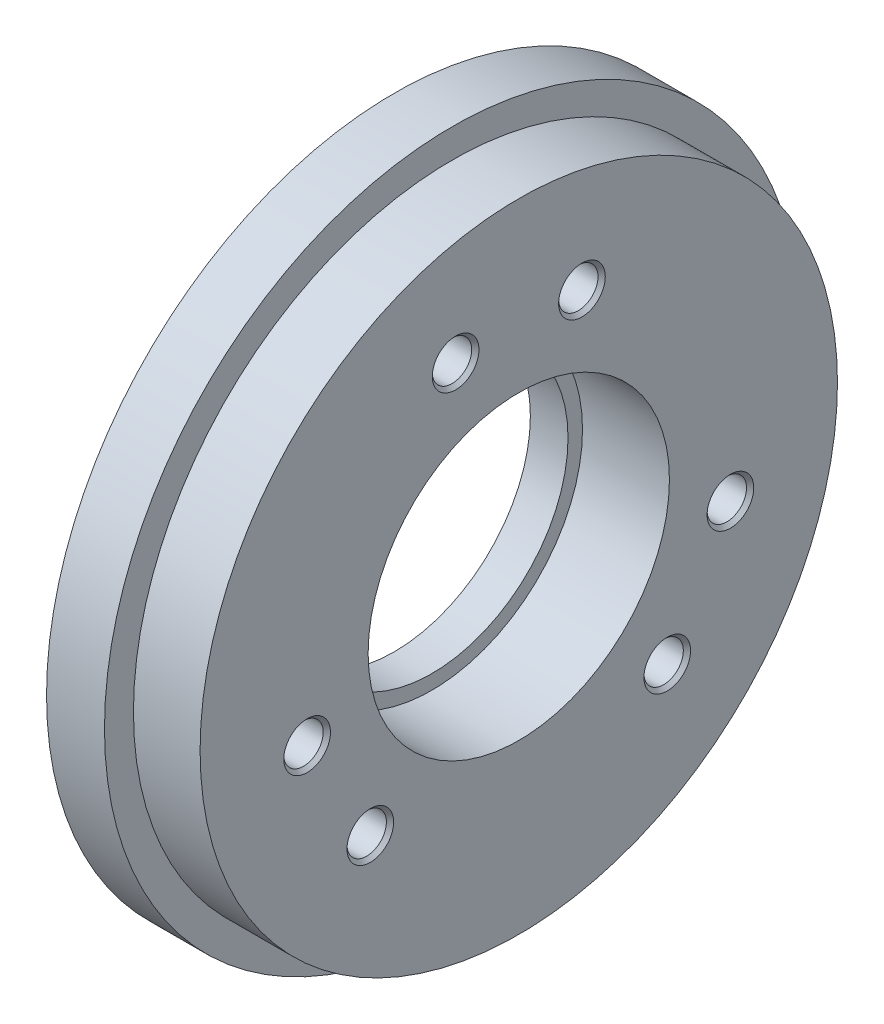
ISO-10303-21;
HEADER;
FILE_DESCRIPTION(('STEP AP214'),'2;1');
FILE_NAME('part.step','',(''),(''),'','','');
FILE_SCHEMA(('AUTOMOTIVE_DESIGN { 1 0 10303 214 1 1 1 1 }'));
ENDSEC;
DATA;
#1=APPLICATION_CONTEXT('core data for automotive mechanical design processes');
#2=APPLICATION_PROTOCOL_DEFINITION('international standard','automotive_design',2000,#1);
#3=PRODUCT_CONTEXT('',#1,'mechanical');
#4=PRODUCT('Part','Part','',(#3));
#5=PRODUCT_RELATED_PRODUCT_CATEGORY('part','',(#4));
#6=PRODUCT_DEFINITION_FORMATION('','',#4);
#7=PRODUCT_DEFINITION_CONTEXT('part definition',#1,'design');
#8=PRODUCT_DEFINITION('design','',#6,#7);
#9=PRODUCT_DEFINITION_SHAPE('','',#8);
#10=(LENGTH_UNIT() NAMED_UNIT(*) SI_UNIT(.MILLI.,.METRE.));
#11=(NAMED_UNIT(*) PLANE_ANGLE_UNIT() SI_UNIT($,.RADIAN.));
#12=(NAMED_UNIT(*) SI_UNIT($,.STERADIAN.) SOLID_ANGLE_UNIT());
#13=UNCERTAINTY_MEASURE_WITH_UNIT(LENGTH_MEASURE(1.E-05),#10,'distance_accuracy_value','');
#14=(GEOMETRIC_REPRESENTATION_CONTEXT(3) GLOBAL_UNCERTAINTY_ASSIGNED_CONTEXT((#13)) GLOBAL_UNIT_ASSIGNED_CONTEXT((#10,
#11,#12)) REPRESENTATION_CONTEXT('',''));
#15=CARTESIAN_POINT('',(0.,0.,0.));
#16=DIRECTION('',(0.,0.,1.));
#17=DIRECTION('',(1.,0.,0.));
#18=AXIS2_PLACEMENT_3D('',#15,#16,#17);
#19=CARTESIAN_POINT('',(-11.5,0.,0.));
#20=DIRECTION('',(1.,0.,0.));
#21=DIRECTION('',(0.,0.,-1.));
#22=AXIS2_PLACEMENT_3D('',#19,#20,#21);
#23=CYLINDRICAL_SURFACE('',#22,55.);
#24=CARTESIAN_POINT('',(-11.5,0.,0.));
#25=DIRECTION('',(-1.,0.,0.));
#26=DIRECTION('',(0.,0.,1.));
#27=AXIS2_PLACEMENT_3D('',#24,#25,#26);
#28=CIRCLE('',#27,55.);
#29=CARTESIAN_POINT('',(-11.5,0.,55.));
#30=VERTEX_POINT('',#29);
#31=EDGE_CURVE('E21',#30,#30,#28,.F.);
#32=ORIENTED_EDGE('',*,*,#31,.T.);
#33=EDGE_LOOP('',(#32));
#34=FACE_BOUND('',#33,.T.);
#35=CARTESIAN_POINT('',(0.,0.,0.));
#36=DIRECTION('',(1.,0.,0.));
#37=DIRECTION('',(0.,0.,-1.));
#38=AXIS2_PLACEMENT_3D('',#35,#36,#37);
#39=CIRCLE('',#38,55.);
#40=CARTESIAN_POINT('',(0.,0.,-55.));
#41=VERTEX_POINT('',#40);
#42=EDGE_CURVE('E10',#41,#41,#39,.T.);
#43=ORIENTED_EDGE('',*,*,#42,.F.);
#44=EDGE_LOOP('',(#43));
#45=FACE_BOUND('',#44,.T.);
#46=ADVANCED_FACE('F15',(#34,#45),#23,.T.);
#47=CARTESIAN_POINT('',(0.,0.,0.));
#48=DIRECTION('',(1.,0.,0.));
#49=DIRECTION('',(0.,0.,-1.));
#50=AXIS2_PLACEMENT_3D('',#47,#48,#49);
#51=PLANE('',#50);
#52=CARTESIAN_POINT('',(0.,-27.3810853732778,-25.6227665130304));
#53=DIRECTION('',(1.,0.,0.));
#54=DIRECTION('',(0.,-0.866025403784443,0.499999999999992));
#55=AXIS2_PLACEMENT_3D('',#52,#53,#54);
#56=CIRCLE('',#55,4.025);
#57=CARTESIAN_POINT('',(0.,-30.8668376235102,-23.6102665130304));
#58=VERTEX_POINT('',#57);
#59=EDGE_CURVE('E97',#58,#58,#56,.T.);
#60=ORIENTED_EDGE('',*,*,#59,.F.);
#61=EDGE_LOOP('',(#60));
#62=FACE_BOUND('',#61,.T.);
#63=CARTESIAN_POINT('',(0.,-8.49942402888248,36.5240987729644));
#64=DIRECTION('',(1.,0.,0.));
#65=DIRECTION('',(0.,0.866025403784437,0.5));
#66=AXIS2_PLACEMENT_3D('',#63,#64,#65);
#67=CIRCLE('',#66,4.025);
#68=CARTESIAN_POINT('',(0.,-5.01367177865012,38.5365987729644));
#69=VERTEX_POINT('',#68);
#70=EDGE_CURVE('E88',#69,#69,#67,.T.);
#71=ORIENTED_EDGE('',*,*,#70,.F.);
#72=EDGE_LOOP('',(#71));
#73=FACE_BOUND('',#72,.T.);
#74=CARTESIAN_POINT('',(0.,-8.49942402888142,-36.5240987729646));
#75=DIRECTION('',(1.,0.,0.));
#76=DIRECTION('',(0.,-0.866025403784443,0.499999999999992));
#77=AXIS2_PLACEMENT_3D('',#74,#75,#76);
#78=CIRCLE('',#77,4.025);
#79=CARTESIAN_POINT('',(0.,-11.9851762791138,-34.5115987729646));
#80=VERTEX_POINT('',#79);
#81=EDGE_CURVE('E79',#80,#80,#78,.T.);
#82=ORIENTED_EDGE('',*,*,#81,.F.);
#83=EDGE_LOOP('',(#82));
#84=FACE_BOUND('',#83,.T.);
#85=CARTESIAN_POINT('',(0.,-27.3810853732785,25.6227665130296));
#86=DIRECTION('',(1.,0.,0.));
#87=DIRECTION('',(0.,0.866025403784437,0.5));
#88=AXIS2_PLACEMENT_3D('',#85,#86,#87);
#89=CIRCLE('',#88,4.025);
#90=CARTESIAN_POINT('',(0.,-23.8953331230462,27.6352665130296));
#91=VERTEX_POINT('',#90);
#92=EDGE_CURVE('E70',#91,#91,#89,.T.);
#93=ORIENTED_EDGE('',*,*,#92,.F.);
#94=EDGE_LOOP('',(#93));
#95=FACE_BOUND('',#94,.T.);
#96=CARTESIAN_POINT('',(0.,35.8805094021602,10.9013322599348));
#97=DIRECTION('',(1.,0.,0.));
#98=DIRECTION('',(0.,0.,-1.));
#99=AXIS2_PLACEMENT_3D('',#96,#97,#98);
#100=CIRCLE('',#99,4.025);
#101=CARTESIAN_POINT('',(0.,35.8805094021602,6.87633225993476));
#102=VERTEX_POINT('',#101);
#103=EDGE_CURVE('E61',#102,#102,#100,.T.);
#104=ORIENTED_EDGE('',*,*,#103,.F.);
#105=EDGE_LOOP('',(#104));
#106=FACE_BOUND('',#105,.T.);
#107=CARTESIAN_POINT('',(0.,35.8805094021603,-10.9013322599342));
#108=DIRECTION('',(1.,0.,0.));
#109=DIRECTION('',(0.,0.,-1.));
#110=AXIS2_PLACEMENT_3D('',#107,#108,#109);
#111=CIRCLE('',#110,4.025);
#112=CARTESIAN_POINT('',(0.,35.8805094021603,-14.9263322599342));
#113=VERTEX_POINT('',#112);
#114=EDGE_CURVE('E52',#113,#113,#111,.T.);
#115=ORIENTED_EDGE('',*,*,#114,.F.);
#116=EDGE_LOOP('',(#115));
#117=FACE_BOUND('',#116,.T.);
#118=CARTESIAN_POINT('',(0.,0.,0.));
#119=DIRECTION('',(1.,0.,0.));
#120=DIRECTION('',(0.,0.,-1.));
#121=AXIS2_PLACEMENT_3D('',#118,#119,#120);
#122=CIRCLE('',#121,26.);
#123=CARTESIAN_POINT('',(0.,0.,-26.));
#124=VERTEX_POINT('',#123);
#125=EDGE_CURVE('E35',#124,#124,#122,.T.);
#126=ORIENTED_EDGE('',*,*,#125,.F.);
#127=EDGE_LOOP('',(#126));
#128=FACE_BOUND('',#127,.T.);
#129=ORIENTED_EDGE('',*,*,#42,.T.);
#130=EDGE_LOOP('',(#129));
#131=FACE_BOUND('',#130,.T.);
#132=ADVANCED_FACE('F103',(#62,#73,#84,#95,#106,#117,#128,#131),#51,.T.);
#133=CARTESIAN_POINT('',(-21.5,0.,0.));
#134=DIRECTION('',(1.,0.,0.));
#135=DIRECTION('',(0.,0.,-1.));
#136=AXIS2_PLACEMENT_3D('',#133,#134,#135);
#137=CYLINDRICAL_SURFACE('',#136,60.);
#138=CARTESIAN_POINT('',(-21.5,0.,0.));
#139=DIRECTION('',(-1.,0.,0.));
#140=DIRECTION('',(0.,0.,1.));
#141=AXIS2_PLACEMENT_3D('',#138,#139,#140);
#142=CIRCLE('',#141,60.);
#143=CARTESIAN_POINT('',(-21.5,0.,60.));
#144=VERTEX_POINT('',#143);
#145=EDGE_CURVE('E25',#144,#144,#142,.T.);
#146=ORIENTED_EDGE('',*,*,#145,.F.);
#147=EDGE_LOOP('',(#146));
#148=FACE_BOUND('',#147,.T.);
#149=CARTESIAN_POINT('',(-11.5,0.,0.));
#150=DIRECTION('',(-1.,0.,0.));
#151=DIRECTION('',(0.,0.,1.));
#152=AXIS2_PLACEMENT_3D('',#149,#150,#151);
#153=CIRCLE('',#152,60.);
#154=CARTESIAN_POINT('',(-11.5,0.,60.));
#155=VERTEX_POINT('',#154);
#156=EDGE_CURVE('E29',#155,#155,#153,.T.);
#157=ORIENTED_EDGE('',*,*,#156,.T.);
#158=EDGE_LOOP('',(#157));
#159=FACE_BOUND('',#158,.T.);
#160=ADVANCED_FACE('F106',(#148,#159),#137,.T.);
#161=CARTESIAN_POINT('',(-21.5,0.,0.));
#162=DIRECTION('',(-1.,0.,0.));
#163=DIRECTION('',(0.,0.,1.));
#164=AXIS2_PLACEMENT_3D('',#161,#162,#163);
#165=PLANE('',#164);
#166=CARTESIAN_POINT('',(-21.5,-27.3810853732778,-25.6227665130304));
#167=DIRECTION('',(1.,0.,0.));
#168=DIRECTION('',(0.,-0.866025403784443,0.499999999999992));
#169=AXIS2_PLACEMENT_3D('',#166,#167,#168);
#170=CIRCLE('',#169,3.4);
#171=CARTESIAN_POINT('',(-21.5,-30.3255717461449,-23.9227665130304));
#172=VERTEX_POINT('',#171);
#173=EDGE_CURVE('E94',#172,#172,#170,.T.);
#174=ORIENTED_EDGE('',*,*,#173,.T.);
#175=EDGE_LOOP('',(#174));
#176=FACE_BOUND('',#175,.T.);
#177=CARTESIAN_POINT('',(-21.5,-8.49942402888248,36.5240987729644));
#178=DIRECTION('',(1.,0.,0.));
#179=DIRECTION('',(0.,0.866025403784437,0.5));
#180=AXIS2_PLACEMENT_3D('',#177,#178,#179);
#181=CIRCLE('',#180,3.4);
#182=CARTESIAN_POINT('',(-21.5,-5.55493765601539,38.2240987729644));
#183=VERTEX_POINT('',#182);
#184=EDGE_CURVE('E85',#183,#183,#181,.T.);
#185=ORIENTED_EDGE('',*,*,#184,.T.);
#186=EDGE_LOOP('',(#185));
#187=FACE_BOUND('',#186,.T.);
#188=CARTESIAN_POINT('',(-21.5,-8.49942402888142,-36.5240987729646));
#189=DIRECTION('',(1.,0.,0.));
#190=DIRECTION('',(0.,-0.866025403784443,0.499999999999992));
#191=AXIS2_PLACEMENT_3D('',#188,#189,#190);
#192=CIRCLE('',#191,3.4);
#193=CARTESIAN_POINT('',(-21.5,-11.4439104017485,-34.8240987729646));
#194=VERTEX_POINT('',#193);
#195=EDGE_CURVE('E76',#194,#194,#192,.T.);
#196=ORIENTED_EDGE('',*,*,#195,.T.);
#197=EDGE_LOOP('',(#196));
#198=FACE_BOUND('',#197,.T.);
#199=CARTESIAN_POINT('',(-21.5,-27.3810853732785,25.6227665130296));
#200=DIRECTION('',(1.,0.,0.));
#201=DIRECTION('',(0.,0.866025403784437,0.5));
#202=AXIS2_PLACEMENT_3D('',#199,#200,#201);
#203=CIRCLE('',#202,3.4);
#204=CARTESIAN_POINT('',(-21.5,-24.4365990004115,27.3227665130296));
#205=VERTEX_POINT('',#204);
#206=EDGE_CURVE('E67',#205,#205,#203,.T.);
#207=ORIENTED_EDGE('',*,*,#206,.T.);
#208=EDGE_LOOP('',(#207));
#209=FACE_BOUND('',#208,.T.);
#210=CARTESIAN_POINT('',(-21.5,35.8805094021602,10.9013322599348));
#211=DIRECTION('',(1.,0.,0.));
#212=DIRECTION('',(0.,0.,-1.));
#213=AXIS2_PLACEMENT_3D('',#210,#211,#212);
#214=CIRCLE('',#213,3.4);
#215=CARTESIAN_POINT('',(-21.5,35.8805094021602,7.50133225993476));
#216=VERTEX_POINT('',#215);
#217=EDGE_CURVE('E55',#216,#216,#214,.T.);
#218=ORIENTED_EDGE('',*,*,#217,.T.);
#219=EDGE_LOOP('',(#218));
#220=FACE_BOUND('',#219,.T.);
#221=CARTESIAN_POINT('',(-21.5,35.8805094021603,-10.9013322599342));
#222=DIRECTION('',(1.,0.,0.));
#223=DIRECTION('',(0.,0.,-1.));
#224=AXIS2_PLACEMENT_3D('',#221,#222,#223);
#225=CIRCLE('',#224,3.4);
#226=CARTESIAN_POINT('',(-21.5,35.8805094021603,-14.3013322599342));
#227=VERTEX_POINT('',#226);
#228=EDGE_CURVE('E46',#227,#227,#225,.T.);
#229=ORIENTED_EDGE('',*,*,#228,.T.);
#230=EDGE_LOOP('',(#229));
#231=FACE_BOUND('',#230,.T.);
#232=CARTESIAN_POINT('',(-21.5,0.,0.));
#233=DIRECTION('',(-1.,0.,0.));
#234=DIRECTION('',(0.,0.,1.));
#235=AXIS2_PLACEMENT_3D('',#232,#233,#234);
#236=CIRCLE('',#235,23.5);
#237=CARTESIAN_POINT('',(-21.5,0.,23.5));
#238=VERTEX_POINT('',#237);
#239=EDGE_CURVE('E38',#238,#238,#236,.T.);
#240=ORIENTED_EDGE('',*,*,#239,.F.);
#241=EDGE_LOOP('',(#240));
#242=FACE_BOUND('',#241,.T.);
#243=ORIENTED_EDGE('',*,*,#145,.T.);
#244=EDGE_LOOP('',(#243));
#245=FACE_BOUND('',#244,.T.);
#246=ADVANCED_FACE('F134',(#176,#187,#198,#209,#220,#231,#242,#245),#165,.T.);
#247=CARTESIAN_POINT('',(-11.5,0.,0.));
#248=DIRECTION('',(-1.,0.,0.));
#249=DIRECTION('',(0.,0.,1.));
#250=AXIS2_PLACEMENT_3D('',#247,#248,#249);
#251=PLANE('',#250);
#252=ORIENTED_EDGE('',*,*,#31,.F.);
#253=EDGE_LOOP('',(#252));
#254=FACE_BOUND('',#253,.T.);
#255=ORIENTED_EDGE('',*,*,#156,.F.);
#256=EDGE_LOOP('',(#255));
#257=FACE_BOUND('',#256,.T.);
#258=ADVANCED_FACE('F122',(#254,#257),#251,.F.);
#259=CARTESIAN_POINT('',(-15.,0.,0.));
#260=DIRECTION('',(1.,0.,0.));
#261=DIRECTION('',(0.,0.,-1.));
#262=AXIS2_PLACEMENT_3D('',#259,#260,#261);
#263=CYLINDRICAL_SURFACE('',#262,26.);
#264=CARTESIAN_POINT('',(-15.,0.,0.));
#265=DIRECTION('',(1.,0.,0.));
#266=DIRECTION('',(0.,0.,-1.));
#267=AXIS2_PLACEMENT_3D('',#264,#265,#266);
#268=CIRCLE('',#267,26.);
#269=CARTESIAN_POINT('',(-15.,0.,-26.));
#270=VERTEX_POINT('',#269);
#271=EDGE_CURVE('E33',#270,#270,#268,.T.);
#272=ORIENTED_EDGE('',*,*,#271,.F.);
#273=EDGE_LOOP('',(#272));
#274=FACE_BOUND('',#273,.T.);
#275=ORIENTED_EDGE('',*,*,#125,.T.);
#276=EDGE_LOOP('',(#275));
#277=FACE_BOUND('',#276,.T.);
#278=ADVANCED_FACE('F119',(#274,#277),#263,.F.);
#279=CARTESIAN_POINT('',(-15.,0.,0.));
#280=DIRECTION('',(1.,0.,0.));
#281=DIRECTION('',(0.,0.,-1.));
#282=AXIS2_PLACEMENT_3D('',#279,#280,#281);
#283=PLANE('',#282);
#284=CARTESIAN_POINT('',(-15.,0.,0.));
#285=DIRECTION('',(1.,0.,0.));
#286=DIRECTION('',(0.,0.,-1.));
#287=AXIS2_PLACEMENT_3D('',#284,#285,#286);
#288=CIRCLE('',#287,23.5);
#289=CARTESIAN_POINT('',(-15.,0.,-23.5));
#290=VERTEX_POINT('',#289);
#291=EDGE_CURVE('E43',#290,#290,#288,.T.);
#292=ORIENTED_EDGE('',*,*,#291,.F.);
#293=EDGE_LOOP('',(#292));
#294=FACE_BOUND('',#293,.T.);
#295=ORIENTED_EDGE('',*,*,#271,.T.);
#296=EDGE_LOOP('',(#295));
#297=FACE_BOUND('',#296,.T.);
#298=ADVANCED_FACE('F121',(#294,#297),#283,.T.);
#299=CARTESIAN_POINT('',(-30.,0.,0.));
#300=DIRECTION('',(1.,0.,0.));
#301=DIRECTION('',(0.,0.,-1.));
#302=AXIS2_PLACEMENT_3D('',#299,#300,#301);
#303=CYLINDRICAL_SURFACE('',#302,23.5);
#304=ORIENTED_EDGE('',*,*,#239,.T.);
#305=EDGE_LOOP('',(#304));
#306=FACE_BOUND('',#305,.T.);
#307=ORIENTED_EDGE('',*,*,#291,.T.);
#308=EDGE_LOOP('',(#307));
#309=FACE_BOUND('',#308,.T.);
#310=ADVANCED_FACE('F131',(#306,#309),#303,.F.);
#311=CARTESIAN_POINT('',(0.,35.8805094021603,-10.9013322599342));
#312=DIRECTION('',(1.,0.,0.));
#313=DIRECTION('',(0.,0.,-1.));
#314=AXIS2_PLACEMENT_3D('',#311,#312,#313);
#315=CYLINDRICAL_SURFACE('',#314,3.4);
#316=ORIENTED_EDGE('',*,*,#228,.F.);
#317=EDGE_LOOP('',(#316));
#318=FACE_BOUND('',#317,.T.);
#319=CARTESIAN_POINT('',(-0.625,35.8805094021603,-10.9013322599342));
#320=DIRECTION('',(1.,0.,0.));
#321=DIRECTION('',(0.,0.,-1.));
#322=AXIS2_PLACEMENT_3D('',#319,#320,#321);
#323=CIRCLE('',#322,3.4);
#324=CARTESIAN_POINT('',(-0.625,35.8805094021603,-14.3013322599342));
#325=VERTEX_POINT('',#324);
#326=EDGE_CURVE('E49',#325,#325,#323,.T.);
#327=ORIENTED_EDGE('',*,*,#326,.T.);
#328=EDGE_LOOP('',(#327));
#329=FACE_BOUND('',#328,.T.);
#330=ADVANCED_FACE('F191',(#318,#329),#315,.F.);
#331=CARTESIAN_POINT('',(0.,35.8805094021603,-10.9013322599342));
#332=DIRECTION('',(1.,0.,0.));
#333=DIRECTION('',(0.,0.,-1.));
#334=AXIS2_PLACEMENT_3D('',#331,#332,#333);
#335=CONICAL_SURFACE('',#334,4.025,0.785398163397444);
#336=ORIENTED_EDGE('',*,*,#326,.F.);
#337=EDGE_LOOP('',(#336));
#338=FACE_BOUND('',#337,.T.);
#339=ORIENTED_EDGE('',*,*,#114,.T.);
#340=EDGE_LOOP('',(#339));
#341=FACE_BOUND('',#340,.T.);
#342=ADVANCED_FACE('F202',(#338,#341),#335,.F.);
#343=CARTESIAN_POINT('',(0.,35.8805094021602,10.9013322599348));
#344=DIRECTION('',(1.,0.,0.));
#345=DIRECTION('',(0.,0.,-1.));
#346=AXIS2_PLACEMENT_3D('',#343,#344,#345);
#347=CYLINDRICAL_SURFACE('',#346,3.4);
#348=ORIENTED_EDGE('',*,*,#217,.F.);
#349=EDGE_LOOP('',(#348));
#350=FACE_BOUND('',#349,.T.);
#351=CARTESIAN_POINT('',(-0.625,35.8805094021602,10.9013322599348));
#352=DIRECTION('',(1.,0.,0.));
#353=DIRECTION('',(0.,0.,-1.));
#354=AXIS2_PLACEMENT_3D('',#351,#352,#353);
#355=CIRCLE('',#354,3.4);
#356=CARTESIAN_POINT('',(-0.625,35.8805094021602,7.50133225993476));
#357=VERTEX_POINT('',#356);
#358=EDGE_CURVE('E58',#357,#357,#355,.T.);
#359=ORIENTED_EDGE('',*,*,#358,.T.);
#360=EDGE_LOOP('',(#359));
#361=FACE_BOUND('',#360,.T.);
#362=ADVANCED_FACE('F212',(#350,#361),#347,.F.);
#363=CARTESIAN_POINT('',(0.,35.8805094021602,10.9013322599348));
#364=DIRECTION('',(1.,0.,0.));
#365=DIRECTION('',(0.,0.,-1.));
#366=AXIS2_PLACEMENT_3D('',#363,#364,#365);
#367=CONICAL_SURFACE('',#366,4.025,0.785398163397444);
#368=ORIENTED_EDGE('',*,*,#358,.F.);
#369=EDGE_LOOP('',(#368));
#370=FACE_BOUND('',#369,.T.);
#371=ORIENTED_EDGE('',*,*,#103,.T.);
#372=EDGE_LOOP('',(#371));
#373=FACE_BOUND('',#372,.T.);
#374=ADVANCED_FACE('F223',(#370,#373),#367,.F.);
#375=CARTESIAN_POINT('',(0.,-27.3810853732785,25.6227665130296));
#376=DIRECTION('',(1.,0.,0.));
#377=DIRECTION('',(0.,0.866025403784437,0.5));
#378=AXIS2_PLACEMENT_3D('',#375,#376,#377);
#379=CYLINDRICAL_SURFACE('',#378,3.4);
#380=ORIENTED_EDGE('',*,*,#206,.F.);
#381=EDGE_LOOP('',(#380));
#382=FACE_BOUND('',#381,.T.);
#383=CARTESIAN_POINT('',(-0.625,-27.3810853732785,25.6227665130296));
#384=DIRECTION('',(1.,0.,0.));
#385=DIRECTION('',(0.,0.866025403784437,0.5));
#386=AXIS2_PLACEMENT_3D('',#383,#384,#385);
#387=CIRCLE('',#386,3.4);
#388=CARTESIAN_POINT('',(-0.625,-24.4365990004115,27.3227665130296));
#389=VERTEX_POINT('',#388);
#390=EDGE_CURVE('E64',#389,#389,#387,.T.);
#391=ORIENTED_EDGE('',*,*,#390,.T.);
#392=EDGE_LOOP('',(#391));
#393=FACE_BOUND('',#392,.T.);
#394=ADVANCED_FACE('F233',(#382,#393),#379,.F.);
#395=CARTESIAN_POINT('',(0.,-27.3810853732785,25.6227665130296));
#396=DIRECTION('',(1.,0.,0.));
#397=DIRECTION('',(0.,0.866025403784437,0.5));
#398=AXIS2_PLACEMENT_3D('',#395,#396,#397);
#399=CONICAL_SURFACE('',#398,4.025,0.785398163397444);
#400=ORIENTED_EDGE('',*,*,#390,.F.);
#401=EDGE_LOOP('',(#400));
#402=FACE_BOUND('',#401,.T.);
#403=ORIENTED_EDGE('',*,*,#92,.T.);
#404=EDGE_LOOP('',(#403));
#405=FACE_BOUND('',#404,.T.);
#406=ADVANCED_FACE('F244',(#402,#405),#399,.F.);
#407=CARTESIAN_POINT('',(0.,-8.49942402888142,-36.5240987729646));
#408=DIRECTION('',(1.,0.,0.));
#409=DIRECTION('',(0.,-0.866025403784443,0.499999999999992));
#410=AXIS2_PLACEMENT_3D('',#407,#408,#409);
#411=CYLINDRICAL_SURFACE('',#410,3.4);
#412=ORIENTED_EDGE('',*,*,#195,.F.);
#413=EDGE_LOOP('',(#412));
#414=FACE_BOUND('',#413,.T.);
#415=CARTESIAN_POINT('',(-0.625,-8.49942402888142,-36.5240987729646));
#416=DIRECTION('',(1.,0.,0.));
#417=DIRECTION('',(0.,-0.866025403784443,0.499999999999992));
#418=AXIS2_PLACEMENT_3D('',#415,#416,#417);
#419=CIRCLE('',#418,3.4);
#420=CARTESIAN_POINT('',(-0.625,-11.4439104017485,-34.8240987729646));
#421=VERTEX_POINT('',#420);
#422=EDGE_CURVE('E73',#421,#421,#419,.T.);
#423=ORIENTED_EDGE('',*,*,#422,.T.);
#424=EDGE_LOOP('',(#423));
#425=FACE_BOUND('',#424,.T.);
#426=ADVANCED_FACE('F254',(#414,#425),#411,.F.);
#427=CARTESIAN_POINT('',(0.,-8.49942402888142,-36.5240987729646));
#428=DIRECTION('',(1.,0.,0.));
#429=DIRECTION('',(0.,-0.866025403784443,0.499999999999992));
#430=AXIS2_PLACEMENT_3D('',#427,#428,#429);
#431=CONICAL_SURFACE('',#430,4.025,0.785398163397444);
#432=ORIENTED_EDGE('',*,*,#422,.F.);
#433=EDGE_LOOP('',(#432));
#434=FACE_BOUND('',#433,.T.);
#435=ORIENTED_EDGE('',*,*,#81,.T.);
#436=EDGE_LOOP('',(#435));
#437=FACE_BOUND('',#436,.T.);
#438=ADVANCED_FACE('F265',(#434,#437),#431,.F.);
#439=CARTESIAN_POINT('',(0.,-8.49942402888248,36.5240987729644));
#440=DIRECTION('',(1.,0.,0.));
#441=DIRECTION('',(0.,0.866025403784437,0.5));
#442=AXIS2_PLACEMENT_3D('',#439,#440,#441);
#443=CYLINDRICAL_SURFACE('',#442,3.4);
#444=ORIENTED_EDGE('',*,*,#184,.F.);
#445=EDGE_LOOP('',(#444));
#446=FACE_BOUND('',#445,.T.);
#447=CARTESIAN_POINT('',(-0.625,-8.49942402888248,36.5240987729644));
#448=DIRECTION('',(1.,0.,0.));
#449=DIRECTION('',(0.,0.866025403784437,0.5));
#450=AXIS2_PLACEMENT_3D('',#447,#448,#449);
#451=CIRCLE('',#450,3.4);
#452=CARTESIAN_POINT('',(-0.625,-5.55493765601539,38.2240987729644));
#453=VERTEX_POINT('',#452);
#454=EDGE_CURVE('E82',#453,#453,#451,.T.);
#455=ORIENTED_EDGE('',*,*,#454,.T.);
#456=EDGE_LOOP('',(#455));
#457=FACE_BOUND('',#456,.T.);
#458=ADVANCED_FACE('F275',(#446,#457),#443,.F.);
#459=CARTESIAN_POINT('',(0.,-8.49942402888248,36.5240987729644));
#460=DIRECTION('',(1.,0.,0.));
#461=DIRECTION('',(0.,0.866025403784437,0.5));
#462=AXIS2_PLACEMENT_3D('',#459,#460,#461);
#463=CONICAL_SURFACE('',#462,4.025,0.785398163397444);
#464=ORIENTED_EDGE('',*,*,#454,.F.);
#465=EDGE_LOOP('',(#464));
#466=FACE_BOUND('',#465,.T.);
#467=ORIENTED_EDGE('',*,*,#70,.T.);
#468=EDGE_LOOP('',(#467));
#469=FACE_BOUND('',#468,.T.);
#470=ADVANCED_FACE('F286',(#466,#469),#463,.F.);
#471=CARTESIAN_POINT('',(0.,-27.3810853732778,-25.6227665130304));
#472=DIRECTION('',(1.,0.,0.));
#473=DIRECTION('',(0.,-0.866025403784443,0.499999999999992));
#474=AXIS2_PLACEMENT_3D('',#471,#472,#473);
#475=CYLINDRICAL_SURFACE('',#474,3.4);
#476=ORIENTED_EDGE('',*,*,#173,.F.);
#477=EDGE_LOOP('',(#476));
#478=FACE_BOUND('',#477,.T.);
#479=CARTESIAN_POINT('',(-0.625,-27.3810853732778,-25.6227665130304));
#480=DIRECTION('',(1.,0.,0.));
#481=DIRECTION('',(0.,-0.866025403784443,0.499999999999992));
#482=AXIS2_PLACEMENT_3D('',#479,#480,#481);
#483=CIRCLE('',#482,3.4);
#484=CARTESIAN_POINT('',(-0.625,-30.3255717461449,-23.9227665130304));
#485=VERTEX_POINT('',#484);
#486=EDGE_CURVE('E91',#485,#485,#483,.T.);
#487=ORIENTED_EDGE('',*,*,#486,.T.);
#488=EDGE_LOOP('',(#487));
#489=FACE_BOUND('',#488,.T.);
#490=ADVANCED_FACE('F296',(#478,#489),#475,.F.);
#491=CARTESIAN_POINT('',(0.,-27.3810853732778,-25.6227665130304));
#492=DIRECTION('',(1.,0.,0.));
#493=DIRECTION('',(0.,-0.866025403784443,0.499999999999992));
#494=AXIS2_PLACEMENT_3D('',#491,#492,#493);
#495=CONICAL_SURFACE('',#494,4.025,0.785398163397444);
#496=ORIENTED_EDGE('',*,*,#486,.F.);
#497=EDGE_LOOP('',(#496));
#498=FACE_BOUND('',#497,.T.);
#499=ORIENTED_EDGE('',*,*,#59,.T.);
#500=EDGE_LOOP('',(#499));
#501=FACE_BOUND('',#500,.T.);
#502=ADVANCED_FACE('F101',(#498,#501),#495,.F.);
#503=CLOSED_SHELL('',(#46,#132,#160,#246,#258,#278,#298,#310,#330,#342,#362,#374,#394,#406,#426,
#438,#458,#470,#490,#502));
#504=MANIFOLD_SOLID_BREP('B1',#503);
#505=ADVANCED_BREP_SHAPE_REPRESENTATION('',(#18,#504),#14);
#506=SHAPE_DEFINITION_REPRESENTATION(#9,#505);
ENDSEC;
END-ISO-10303-21;
